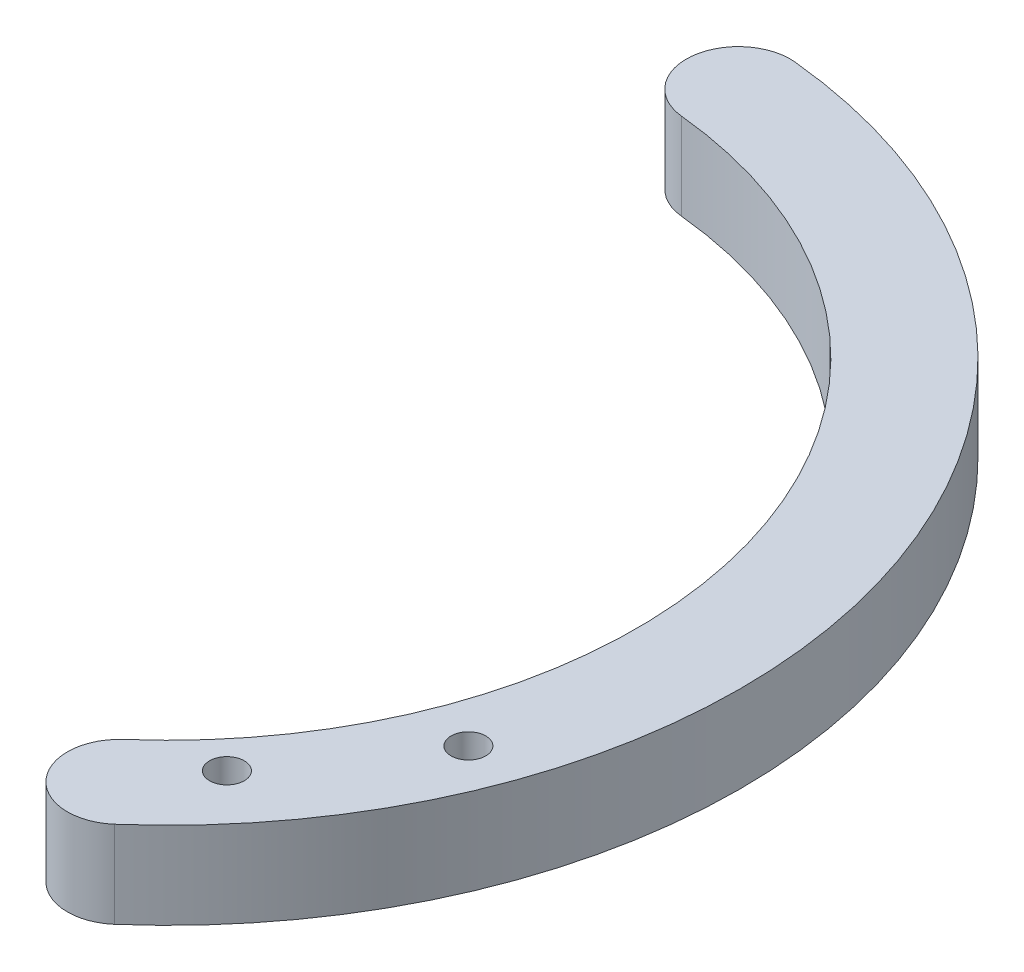
ISO-10303-21;
HEADER;
FILE_DESCRIPTION(('STEP AP214'),'2;1');
FILE_NAME('part.step','',(''),(''),'','','');
FILE_SCHEMA(('AUTOMOTIVE_DESIGN { 1 0 10303 214 1 1 1 1 }'));
ENDSEC;
DATA;
#1=APPLICATION_CONTEXT('core data for automotive mechanical design processes');
#2=APPLICATION_PROTOCOL_DEFINITION('international standard','automotive_design',2000,#1);
#3=PRODUCT_CONTEXT('',#1,'mechanical');
#4=PRODUCT('Part','Part','',(#3));
#5=PRODUCT_RELATED_PRODUCT_CATEGORY('part','',(#4));
#6=PRODUCT_DEFINITION_FORMATION('','',#4);
#7=PRODUCT_DEFINITION_CONTEXT('part definition',#1,'design');
#8=PRODUCT_DEFINITION('design','',#6,#7);
#9=PRODUCT_DEFINITION_SHAPE('','',#8);
#10=(LENGTH_UNIT() NAMED_UNIT(*) SI_UNIT(.MILLI.,.METRE.));
#11=(NAMED_UNIT(*) PLANE_ANGLE_UNIT() SI_UNIT($,.RADIAN.));
#12=(NAMED_UNIT(*) SI_UNIT($,.STERADIAN.) SOLID_ANGLE_UNIT());
#13=UNCERTAINTY_MEASURE_WITH_UNIT(LENGTH_MEASURE(1.E-05),#10,'distance_accuracy_value','');
#14=(GEOMETRIC_REPRESENTATION_CONTEXT(3) GLOBAL_UNCERTAINTY_ASSIGNED_CONTEXT((#13)) GLOBAL_UNIT_ASSIGNED_CONTEXT((#10,
#11,#12)) REPRESENTATION_CONTEXT('',''));
#15=CARTESIAN_POINT('',(0.,0.,0.));
#16=DIRECTION('',(0.,0.,1.));
#17=DIRECTION('',(1.,0.,0.));
#18=AXIS2_PLACEMENT_3D('',#15,#16,#17);
#19=CARTESIAN_POINT('',(9.875,5.,11.2908978828081));
#20=DIRECTION('',(0.,1.,0.));
#21=DIRECTION('',(0.,0.,1.));
#22=AXIS2_PLACEMENT_3D('',#19,#20,#21);
#23=PLANE('',#22);
#24=CARTESIAN_POINT('',(22.2955002513084,5.,18.9317370714868));
#25=DIRECTION('',(0.,1.,0.));
#26=DIRECTION('',(0.,0.,1.));
#27=AXIS2_PLACEMENT_3D('',#24,#25,#26);
#28=CIRCLE('',#27,1.);
#29=CARTESIAN_POINT('',(22.2955002513084,5.,19.9317370714868));
#30=VERTEX_POINT('',#29);
#31=EDGE_CURVE('E104',#30,#30,#28,.T.);
#32=ORIENTED_EDGE('',*,*,#31,.F.);
#33=EDGE_LOOP('',(#32));
#34=FACE_BOUND('',#33,.T.);
#35=CARTESIAN_POINT('',(19.75,5.,22.5817957656162));
#36=DIRECTION('',(0.,1.,0.));
#37=DIRECTION('',(0.,0.,1.));
#38=AXIS2_PLACEMENT_3D('',#35,#36,#37);
#39=CIRCLE('',#38,3.);
#40=CARTESIAN_POINT('',(17.775,5.,20.3236161890545));
#41=VERTEX_POINT('',#40);
#42=CARTESIAN_POINT('',(21.725,5.,24.8399753421778));
#43=VERTEX_POINT('',#42);
#44=EDGE_CURVE('E89',#41,#43,#39,.T.);
#45=ORIENTED_EDGE('',*,*,#44,.T.);
#46=CARTESIAN_POINT('',(0.,5.,0.));
#47=DIRECTION('',(0.,1.,0.));
#48=DIRECTION('',(0.,0.,1.));
#49=AXIS2_PLACEMENT_3D('',#46,#47,#48);
#50=CIRCLE('',#49,33.);
#51=CARTESIAN_POINT('',(3.3,5.,-32.8345854245185));
#52=VERTEX_POINT('',#51);
#53=EDGE_CURVE('E84',#43,#52,#50,.T.);
#54=ORIENTED_EDGE('',*,*,#53,.T.);
#55=CARTESIAN_POINT('',(3.,5.,-29.8496231131986));
#56=DIRECTION('',(0.,1.,0.));
#57=DIRECTION('',(0.,0.,1.));
#58=AXIS2_PLACEMENT_3D('',#55,#56,#57);
#59=CIRCLE('',#58,3.);
#60=CARTESIAN_POINT('',(2.7,5.,-26.8646608018787));
#61=VERTEX_POINT('',#60);
#62=EDGE_CURVE('E87',#52,#61,#59,.T.);
#63=ORIENTED_EDGE('',*,*,#62,.T.);
#64=CARTESIAN_POINT('',(0.,5.,0.));
#65=DIRECTION('',(0.,-1.,0.));
#66=DIRECTION('',(0.,0.,1.));
#67=AXIS2_PLACEMENT_3D('',#64,#65,#66);
#68=CIRCLE('',#67,27.);
#69=EDGE_CURVE('E54',#61,#41,#68,.T.);
#70=ORIENTED_EDGE('',*,*,#69,.T.);
#71=EDGE_LOOP('',(#45,#54,#63,#70));
#72=FACE_BOUND('',#71,.T.);
#73=CARTESIAN_POINT('',(28.0157255351474,5.,10.7293579835558));
#74=DIRECTION('',(0.,1.,0.));
#75=DIRECTION('',(0.,0.,1.));
#76=AXIS2_PLACEMENT_3D('',#73,#74,#75);
#77=CIRCLE('',#76,0.999999999999998);
#78=CARTESIAN_POINT('',(28.0157255351474,5.,11.7293579835558));
#79=VERTEX_POINT('',#78);
#80=EDGE_CURVE('E119',#79,#79,#77,.T.);
#81=ORIENTED_EDGE('',*,*,#80,.F.);
#82=EDGE_LOOP('',(#81));
#83=FACE_BOUND('',#82,.T.);
#84=ADVANCED_FACE('F37',(#34,#72,#83),#23,.T.);
#85=CARTESIAN_POINT('',(9.875,0.,11.2908978828081));
#86=DIRECTION('',(0.,1.,0.));
#87=DIRECTION('',(0.,0.,1.));
#88=AXIS2_PLACEMENT_3D('',#85,#86,#87);
#89=PLANE('',#88);
#90=CARTESIAN_POINT('',(19.75,0.,22.5817957656162));
#91=DIRECTION('',(0.,1.,0.));
#92=DIRECTION('',(0.,0.,1.));
#93=AXIS2_PLACEMENT_3D('',#90,#91,#92);
#94=CIRCLE('',#93,3.);
#95=CARTESIAN_POINT('',(17.775,0.,20.3236161890545));
#96=VERTEX_POINT('',#95);
#97=CARTESIAN_POINT('',(21.725,0.,24.8399753421778));
#98=VERTEX_POINT('',#97);
#99=EDGE_CURVE('E101',#96,#98,#94,.T.);
#100=ORIENTED_EDGE('',*,*,#99,.F.);
#101=CARTESIAN_POINT('',(0.,0.,0.));
#102=DIRECTION('',(0.,-1.,0.));
#103=DIRECTION('',(0.,0.,1.));
#104=AXIS2_PLACEMENT_3D('',#101,#102,#103);
#105=CIRCLE('',#104,27.);
#106=CARTESIAN_POINT('',(2.7,0.,-26.8646608018787));
#107=VERTEX_POINT('',#106);
#108=EDGE_CURVE('E77',#107,#96,#105,.T.);
#109=ORIENTED_EDGE('',*,*,#108,.F.);
#110=CARTESIAN_POINT('',(3.,0.,-29.8496231131986));
#111=DIRECTION('',(0.,1.,0.));
#112=DIRECTION('',(0.,0.,1.));
#113=AXIS2_PLACEMENT_3D('',#110,#111,#112);
#114=CIRCLE('',#113,3.);
#115=CARTESIAN_POINT('',(3.3,0.,-32.8345854245185));
#116=VERTEX_POINT('',#115);
#117=EDGE_CURVE('E71',#116,#107,#114,.T.);
#118=ORIENTED_EDGE('',*,*,#117,.F.);
#119=CARTESIAN_POINT('',(0.,0.,0.));
#120=DIRECTION('',(0.,1.,0.));
#121=DIRECTION('',(0.,0.,1.));
#122=AXIS2_PLACEMENT_3D('',#119,#120,#121);
#123=CIRCLE('',#122,33.);
#124=EDGE_CURVE('E93',#98,#116,#123,.T.);
#125=ORIENTED_EDGE('',*,*,#124,.F.);
#126=EDGE_LOOP('',(#100,#109,#118,#125));
#127=FACE_BOUND('',#126,.T.);
#128=CARTESIAN_POINT('',(22.2955002513084,0.,18.9317370714868));
#129=DIRECTION('',(0.,1.,0.));
#130=DIRECTION('',(0.,0.,1.));
#131=AXIS2_PLACEMENT_3D('',#128,#129,#130);
#132=CIRCLE('',#131,1.);
#133=CARTESIAN_POINT('',(22.2955002513084,0.,19.9317370714868));
#134=VERTEX_POINT('',#133);
#135=EDGE_CURVE('E116',#134,#134,#132,.T.);
#136=ORIENTED_EDGE('',*,*,#135,.T.);
#137=EDGE_LOOP('',(#136));
#138=FACE_BOUND('',#137,.T.);
#139=CARTESIAN_POINT('',(28.0157255351474,0.,10.7293579835558));
#140=DIRECTION('',(0.,1.,0.));
#141=DIRECTION('',(0.,0.,1.));
#142=AXIS2_PLACEMENT_3D('',#139,#140,#141);
#143=CIRCLE('',#142,0.999999999999998);
#144=CARTESIAN_POINT('',(28.0157255351474,0.,11.7293579835558));
#145=VERTEX_POINT('',#144);
#146=EDGE_CURVE('E122',#145,#145,#143,.T.);
#147=ORIENTED_EDGE('',*,*,#146,.T.);
#148=EDGE_LOOP('',(#147));
#149=FACE_BOUND('',#148,.T.);
#150=ADVANCED_FACE('F112',(#127,#138,#149),#89,.F.);
#151=CARTESIAN_POINT('',(19.75,5.,22.5817957656162));
#152=DIRECTION('',(0.,-1.,0.));
#153=DIRECTION('',(0.,0.,-1.));
#154=AXIS2_PLACEMENT_3D('',#151,#152,#153);
#155=CYLINDRICAL_SURFACE('',#154,3.);
#156=ORIENTED_EDGE('',*,*,#99,.T.);
#157=DIRECTION('',(0.,-1.,0.));
#158=VECTOR('',#157,1.);
#159=CARTESIAN_POINT('',(21.725,5.,24.8399753421778));
#160=LINE('',#159,#158);
#161=EDGE_CURVE('E11',#43,#98,#160,.T.);
#162=ORIENTED_EDGE('',*,*,#161,.F.);
#163=ORIENTED_EDGE('',*,*,#44,.F.);
#164=DIRECTION('',(0.,-1.,0.));
#165=VECTOR('',#164,1.);
#166=CARTESIAN_POINT('',(17.775,5.,20.3236161890545));
#167=LINE('',#166,#165);
#168=EDGE_CURVE('E97',#41,#96,#167,.T.);
#169=ORIENTED_EDGE('',*,*,#168,.T.);
#170=EDGE_LOOP('',(#156,#162,#163,#169));
#171=FACE_BOUND('',#170,.T.);
#172=ADVANCED_FACE('F39',(#171),#155,.T.);
#173=CARTESIAN_POINT('',(0.,5.,0.));
#174=DIRECTION('',(0.,-1.,0.));
#175=DIRECTION('',(0.,0.,-1.));
#176=AXIS2_PLACEMENT_3D('',#173,#174,#175);
#177=CYLINDRICAL_SURFACE('',#176,33.);
#178=ORIENTED_EDGE('',*,*,#124,.T.);
#179=DIRECTION('',(0.,-1.,0.));
#180=VECTOR('',#179,1.);
#181=CARTESIAN_POINT('',(3.3,5.,-32.8345854245185));
#182=LINE('',#181,#180);
#183=EDGE_CURVE('E46',#52,#116,#182,.T.);
#184=ORIENTED_EDGE('',*,*,#183,.F.);
#185=ORIENTED_EDGE('',*,*,#53,.F.);
#186=ORIENTED_EDGE('',*,*,#161,.T.);
#187=EDGE_LOOP('',(#178,#184,#185,#186));
#188=FACE_BOUND('',#187,.T.);
#189=ADVANCED_FACE('F92',(#188),#177,.T.);
#190=CARTESIAN_POINT('',(3.,5.,-29.8496231131986));
#191=DIRECTION('',(0.,-1.,0.));
#192=DIRECTION('',(0.,0.,-1.));
#193=AXIS2_PLACEMENT_3D('',#190,#191,#192);
#194=CYLINDRICAL_SURFACE('',#193,3.);
#195=ORIENTED_EDGE('',*,*,#117,.T.);
#196=DIRECTION('',(0.,-1.,0.));
#197=VECTOR('',#196,1.);
#198=CARTESIAN_POINT('',(2.7,5.,-26.8646608018787));
#199=LINE('',#198,#197);
#200=EDGE_CURVE('E94',#61,#107,#199,.T.);
#201=ORIENTED_EDGE('',*,*,#200,.F.);
#202=ORIENTED_EDGE('',*,*,#62,.F.);
#203=ORIENTED_EDGE('',*,*,#183,.T.);
#204=EDGE_LOOP('',(#195,#201,#202,#203));
#205=FACE_BOUND('',#204,.T.);
#206=ADVANCED_FACE('F95',(#205),#194,.T.);
#207=CARTESIAN_POINT('',(0.,5.,0.));
#208=DIRECTION('',(0.,-1.,0.));
#209=DIRECTION('',(0.,0.,-1.));
#210=AXIS2_PLACEMENT_3D('',#207,#208,#209);
#211=CYLINDRICAL_SURFACE('',#210,27.);
#212=ORIENTED_EDGE('',*,*,#108,.T.);
#213=ORIENTED_EDGE('',*,*,#168,.F.);
#214=ORIENTED_EDGE('',*,*,#69,.F.);
#215=ORIENTED_EDGE('',*,*,#200,.T.);
#216=EDGE_LOOP('',(#212,#213,#214,#215));
#217=FACE_BOUND('',#216,.T.);
#218=ADVANCED_FACE('F109',(#217),#211,.F.);
#219=CARTESIAN_POINT('',(22.2955002513084,5.,18.9317370714868));
#220=DIRECTION('',(0.,-1.,0.));
#221=DIRECTION('',(0.,0.,-1.));
#222=AXIS2_PLACEMENT_3D('',#219,#220,#221);
#223=CYLINDRICAL_SURFACE('',#222,1.);
#224=ORIENTED_EDGE('',*,*,#31,.T.);
#225=EDGE_LOOP('',(#224));
#226=FACE_BOUND('',#225,.T.);
#227=ORIENTED_EDGE('',*,*,#135,.F.);
#228=EDGE_LOOP('',(#227));
#229=FACE_BOUND('',#228,.T.);
#230=ADVANCED_FACE('F139',(#226,#229),#223,.F.);
#231=CARTESIAN_POINT('',(28.0157255351474,5.,10.7293579835558));
#232=DIRECTION('',(0.,-1.,0.));
#233=DIRECTION('',(0.,0.,-1.));
#234=AXIS2_PLACEMENT_3D('',#231,#232,#233);
#235=CYLINDRICAL_SURFACE('',#234,0.999999999999998);
#236=ORIENTED_EDGE('',*,*,#80,.T.);
#237=EDGE_LOOP('',(#236));
#238=FACE_BOUND('',#237,.T.);
#239=ORIENTED_EDGE('',*,*,#146,.F.);
#240=EDGE_LOOP('',(#239));
#241=FACE_BOUND('',#240,.T.);
#242=ADVANCED_FACE('F128',(#238,#241),#235,.F.);
#243=CLOSED_SHELL('',(#84,#150,#172,#189,#206,#218,#230,#242));
#244=MANIFOLD_SOLID_BREP('B2',#243);
#245=ADVANCED_BREP_SHAPE_REPRESENTATION('',(#18,#244),#14);
#246=SHAPE_DEFINITION_REPRESENTATION(#9,#245);
ENDSEC;
END-ISO-10303-21;
